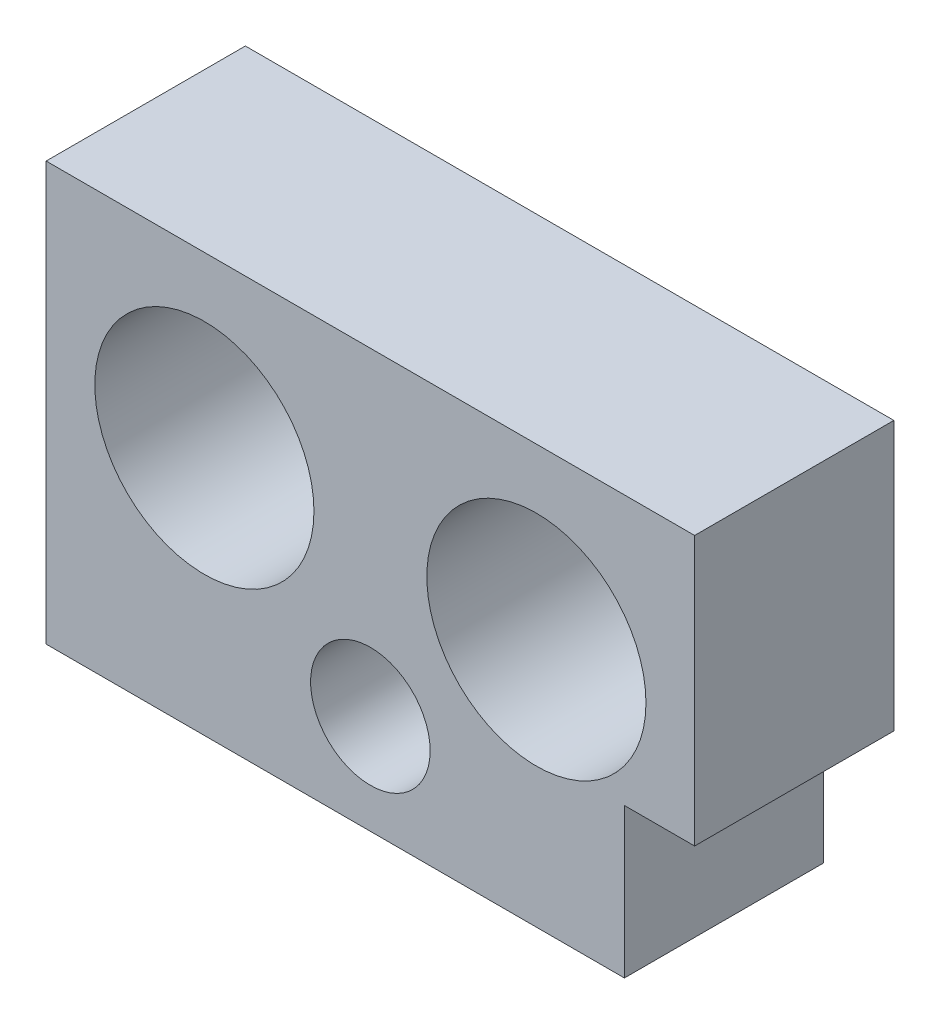
ISO-10303-21;
HEADER;
FILE_DESCRIPTION(('STEP AP214'),'2;1');
FILE_NAME('part.step','',(''),(''),'','','');
FILE_SCHEMA(('AUTOMOTIVE_DESIGN { 1 0 10303 214 1 1 1 1 }'));
ENDSEC;
DATA;
#1=APPLICATION_CONTEXT('core data for automotive mechanical design processes');
#2=APPLICATION_PROTOCOL_DEFINITION('international standard','automotive_design',2000,#1);
#3=PRODUCT_CONTEXT('',#1,'mechanical');
#4=PRODUCT('Part','Part','',(#3));
#5=PRODUCT_RELATED_PRODUCT_CATEGORY('part','',(#4));
#6=PRODUCT_DEFINITION_FORMATION('','',#4);
#7=PRODUCT_DEFINITION_CONTEXT('part definition',#1,'design');
#8=PRODUCT_DEFINITION('design','',#6,#7);
#9=PRODUCT_DEFINITION_SHAPE('','',#8);
#10=(LENGTH_UNIT() NAMED_UNIT(*) SI_UNIT(.MILLI.,.METRE.));
#11=(NAMED_UNIT(*) PLANE_ANGLE_UNIT() SI_UNIT($,.RADIAN.));
#12=(NAMED_UNIT(*) SI_UNIT($,.STERADIAN.) SOLID_ANGLE_UNIT());
#13=UNCERTAINTY_MEASURE_WITH_UNIT(LENGTH_MEASURE(1.E-05),#10,'distance_accuracy_value','');
#14=(GEOMETRIC_REPRESENTATION_CONTEXT(3) GLOBAL_UNCERTAINTY_ASSIGNED_CONTEXT((#13)) GLOBAL_UNIT_ASSIGNED_CONTEXT((#10,
#11,#12)) REPRESENTATION_CONTEXT('',''));
#15=CARTESIAN_POINT('',(0.,0.,0.));
#16=DIRECTION('',(0.,0.,1.));
#17=DIRECTION('',(1.,0.,0.));
#18=AXIS2_PLACEMENT_3D('',#15,#16,#17);
#19=CARTESIAN_POINT('',(32.55,17.,20.));
#20=DIRECTION('',(-1.,0.,0.));
#21=DIRECTION('',(0.,-1.,0.));
#22=AXIS2_PLACEMENT_3D('',#19,#20,#21);
#23=PLANE('',#22);
#24=DIRECTION('',(0.,1.,0.));
#25=VECTOR('',#24,1.);
#26=CARTESIAN_POINT('',(32.55,17.,20.));
#27=LINE('',#26,#25);
#28=CARTESIAN_POINT('',(32.55,-10.,20.));
#29=VERTEX_POINT('',#28);
#30=CARTESIAN_POINT('',(32.55,17.,20.));
#31=VERTEX_POINT('',#30);
#32=EDGE_CURVE('E81',#29,#31,#27,.T.);
#33=ORIENTED_EDGE('',*,*,#32,.F.);
#34=DIRECTION('',(0.,0.,1.));
#35=VECTOR('',#34,1.);
#36=CARTESIAN_POINT('',(32.55,-10.,0.));
#37=LINE('',#36,#35);
#38=CARTESIAN_POINT('',(32.55,-10.,0.));
#39=VERTEX_POINT('',#38);
#40=EDGE_CURVE('E101',#39,#29,#37,.T.);
#41=ORIENTED_EDGE('',*,*,#40,.F.);
#42=DIRECTION('',(0.,1.,0.));
#43=VECTOR('',#42,1.);
#44=CARTESIAN_POINT('',(32.55,17.,0.));
#45=LINE('',#44,#43);
#46=CARTESIAN_POINT('',(32.55,17.,0.));
#47=VERTEX_POINT('',#46);
#48=EDGE_CURVE('E107',#39,#47,#45,.T.);
#49=ORIENTED_EDGE('',*,*,#48,.T.);
#50=DIRECTION('',(0.,0.,-1.));
#51=VECTOR('',#50,1.);
#52=CARTESIAN_POINT('',(32.55,17.,20.));
#53=LINE('',#52,#51);
#54=EDGE_CURVE('E11',#31,#47,#53,.T.);
#55=ORIENTED_EDGE('',*,*,#54,.F.);
#56=EDGE_LOOP('',(#33,#41,#49,#55));
#57=FACE_BOUND('',#56,.T.);
#58=ADVANCED_FACE('F34',(#57),#23,.F.);
#59=CARTESIAN_POINT('',(-32.55,17.,20.));
#60=DIRECTION('',(0.,-1.,0.));
#61=DIRECTION('',(0.,0.,-1.));
#62=AXIS2_PLACEMENT_3D('',#59,#60,#61);
#63=PLANE('',#62);
#64=DIRECTION('',(-1.,0.,0.));
#65=VECTOR('',#64,1.);
#66=CARTESIAN_POINT('',(-32.55,17.,0.));
#67=LINE('',#66,#65);
#68=CARTESIAN_POINT('',(-32.55,17.,0.));
#69=VERTEX_POINT('',#68);
#70=EDGE_CURVE('E112',#47,#69,#67,.T.);
#71=ORIENTED_EDGE('',*,*,#70,.T.);
#72=DIRECTION('',(0.,0.,-1.));
#73=VECTOR('',#72,1.);
#74=CARTESIAN_POINT('',(-32.55,17.,20.));
#75=LINE('',#74,#73);
#76=CARTESIAN_POINT('',(-32.55,17.,20.));
#77=VERTEX_POINT('',#76);
#78=EDGE_CURVE('E41',#77,#69,#75,.T.);
#79=ORIENTED_EDGE('',*,*,#78,.F.);
#80=DIRECTION('',(-1.,0.,0.));
#81=VECTOR('',#80,1.);
#82=CARTESIAN_POINT('',(-32.55,17.,20.));
#83=LINE('',#82,#81);
#84=EDGE_CURVE('E136',#31,#77,#83,.T.);
#85=ORIENTED_EDGE('',*,*,#84,.F.);
#86=ORIENTED_EDGE('',*,*,#54,.T.);
#87=EDGE_LOOP('',(#71,#79,#85,#86));
#88=FACE_BOUND('',#87,.T.);
#89=ADVANCED_FACE('F135',(#88),#63,.F.);
#90=CARTESIAN_POINT('',(-32.55,-25.,20.));
#91=DIRECTION('',(1.,0.,0.));
#92=DIRECTION('',(0.,1.,0.));
#93=AXIS2_PLACEMENT_3D('',#90,#91,#92);
#94=PLANE('',#93);
#95=DIRECTION('',(0.,-1.,0.));
#96=VECTOR('',#95,1.);
#97=CARTESIAN_POINT('',(-32.55,-25.,0.));
#98=LINE('',#97,#96);
#99=CARTESIAN_POINT('',(-32.55,-25.,0.));
#100=VERTEX_POINT('',#99);
#101=EDGE_CURVE('E115',#69,#100,#98,.T.);
#102=ORIENTED_EDGE('',*,*,#101,.T.);
#103=DIRECTION('',(0.,0.,-1.));
#104=VECTOR('',#103,1.);
#105=CARTESIAN_POINT('',(-32.55,-25.,20.));
#106=LINE('',#105,#104);
#107=CARTESIAN_POINT('',(-32.55,-25.,20.));
#108=VERTEX_POINT('',#107);
#109=EDGE_CURVE('E126',#108,#100,#106,.T.);
#110=ORIENTED_EDGE('',*,*,#109,.F.);
#111=DIRECTION('',(0.,-1.,0.));
#112=VECTOR('',#111,1.);
#113=CARTESIAN_POINT('',(-32.55,-25.,20.));
#114=LINE('',#113,#112);
#115=EDGE_CURVE('E121',#77,#108,#114,.T.);
#116=ORIENTED_EDGE('',*,*,#115,.F.);
#117=ORIENTED_EDGE('',*,*,#78,.T.);
#118=EDGE_LOOP('',(#102,#110,#116,#117));
#119=FACE_BOUND('',#118,.T.);
#120=ADVANCED_FACE('F131',(#119),#94,.F.);
#121=CARTESIAN_POINT('',(-30.55,-25.,20.));
#122=DIRECTION('',(0.,1.,0.));
#123=DIRECTION('',(-1.,0.,0.));
#124=AXIS2_PLACEMENT_3D('',#121,#122,#123);
#125=PLANE('',#124);
#126=DIRECTION('',(1.,0.,0.));
#127=VECTOR('',#126,1.);
#128=CARTESIAN_POINT('',(-30.55,-25.,0.));
#129=LINE('',#128,#127);
#130=CARTESIAN_POINT('',(25.5,-25.,0.));
#131=VERTEX_POINT('',#130);
#132=EDGE_CURVE('E75',#100,#131,#129,.T.);
#133=ORIENTED_EDGE('',*,*,#132,.T.);
#134=DIRECTION('',(0.,0.,1.));
#135=VECTOR('',#134,1.);
#136=CARTESIAN_POINT('',(25.5,-25.,0.));
#137=LINE('',#136,#135);
#138=CARTESIAN_POINT('',(25.5,-25.,20.));
#139=VERTEX_POINT('',#138);
#140=EDGE_CURVE('E152',#131,#139,#137,.T.);
#141=ORIENTED_EDGE('',*,*,#140,.T.);
#142=DIRECTION('',(1.,0.,0.));
#143=VECTOR('',#142,1.);
#144=CARTESIAN_POINT('',(32.55,-25.,20.));
#145=LINE('',#144,#143);
#146=EDGE_CURVE('E57',#108,#139,#145,.T.);
#147=ORIENTED_EDGE('',*,*,#146,.F.);
#148=ORIENTED_EDGE('',*,*,#109,.T.);
#149=EDGE_LOOP('',(#133,#141,#147,#148));
#150=FACE_BOUND('',#149,.T.);
#151=ADVANCED_FACE('F160',(#150),#125,.F.);
#152=CARTESIAN_POINT('',(0.,0.,20.));
#153=DIRECTION('',(0.,0.,-1.));
#154=DIRECTION('',(-1.,0.,0.));
#155=AXIS2_PLACEMENT_3D('',#152,#153,#154);
#156=PLANE('',#155);
#157=CARTESIAN_POINT('',(16.665,0.,20.));
#158=DIRECTION('',(0.,0.,1.));
#159=DIRECTION('',(1.,0.,0.));
#160=AXIS2_PLACEMENT_3D('',#157,#158,#159);
#161=CIRCLE('',#160,11.);
#162=CARTESIAN_POINT('',(27.665,0.,20.));
#163=VERTEX_POINT('',#162);
#164=EDGE_CURVE('E143',#163,#163,#161,.T.);
#165=ORIENTED_EDGE('',*,*,#164,.F.);
#166=EDGE_LOOP('',(#165));
#167=FACE_BOUND('',#166,.T.);
#168=CARTESIAN_POINT('',(0.,-15.,20.));
#169=DIRECTION('',(0.,0.,1.));
#170=DIRECTION('',(1.,0.,0.));
#171=AXIS2_PLACEMENT_3D('',#168,#169,#170);
#172=CIRCLE('',#171,6.);
#173=CARTESIAN_POINT('',(6.,-15.,20.));
#174=VERTEX_POINT('',#173);
#175=EDGE_CURVE('E149',#174,#174,#172,.T.);
#176=ORIENTED_EDGE('',*,*,#175,.F.);
#177=EDGE_LOOP('',(#176));
#178=FACE_BOUND('',#177,.T.);
#179=CARTESIAN_POINT('',(-16.665,0.,20.));
#180=DIRECTION('',(0.,0.,1.));
#181=DIRECTION('',(1.,0.,0.));
#182=AXIS2_PLACEMENT_3D('',#179,#180,#181);
#183=CIRCLE('',#182,11.);
#184=CARTESIAN_POINT('',(-5.66500000000001,0.,20.));
#185=VERTEX_POINT('',#184);
#186=EDGE_CURVE('E118',#185,#185,#183,.T.);
#187=ORIENTED_EDGE('',*,*,#186,.F.);
#188=EDGE_LOOP('',(#187));
#189=FACE_BOUND('',#188,.T.);
#190=ORIENTED_EDGE('',*,*,#146,.T.);
#191=DIRECTION('',(0.,-1.,0.));
#192=VECTOR('',#191,1.);
#193=CARTESIAN_POINT('',(25.5,-25.,20.));
#194=LINE('',#193,#192);
#195=CARTESIAN_POINT('',(25.5,-10.,20.));
#196=VERTEX_POINT('',#195);
#197=EDGE_CURVE('E104',#196,#139,#194,.T.);
#198=ORIENTED_EDGE('',*,*,#197,.F.);
#199=DIRECTION('',(-1.,0.,0.));
#200=VECTOR('',#199,1.);
#201=CARTESIAN_POINT('',(32.55,-10.,20.));
#202=LINE('',#201,#200);
#203=EDGE_CURVE('E158',#29,#196,#202,.T.);
#204=ORIENTED_EDGE('',*,*,#203,.F.);
#205=ORIENTED_EDGE('',*,*,#32,.T.);
#206=ORIENTED_EDGE('',*,*,#84,.T.);
#207=ORIENTED_EDGE('',*,*,#115,.T.);
#208=EDGE_LOOP('',(#190,#198,#204,#205,#206,#207));
#209=FACE_BOUND('',#208,.T.);
#210=ADVANCED_FACE('F162',(#167,#178,#189,#209),#156,.F.);
#211=CARTESIAN_POINT('',(0.,0.,0.));
#212=DIRECTION('',(0.,0.,-1.));
#213=DIRECTION('',(-1.,0.,0.));
#214=AXIS2_PLACEMENT_3D('',#211,#212,#213);
#215=PLANE('',#214);
#216=DIRECTION('',(0.,-1.,0.));
#217=VECTOR('',#216,1.);
#218=CARTESIAN_POINT('',(25.5,-25.,0.));
#219=LINE('',#218,#217);
#220=CARTESIAN_POINT('',(25.5,-10.,0.));
#221=VERTEX_POINT('',#220);
#222=EDGE_CURVE('E48',#221,#131,#219,.T.);
#223=ORIENTED_EDGE('',*,*,#222,.T.);
#224=ORIENTED_EDGE('',*,*,#132,.F.);
#225=ORIENTED_EDGE('',*,*,#101,.F.);
#226=ORIENTED_EDGE('',*,*,#70,.F.);
#227=ORIENTED_EDGE('',*,*,#48,.F.);
#228=DIRECTION('',(-1.,0.,0.));
#229=VECTOR('',#228,1.);
#230=CARTESIAN_POINT('',(32.55,-10.,0.));
#231=LINE('',#230,#229);
#232=EDGE_CURVE('E97',#39,#221,#231,.T.);
#233=ORIENTED_EDGE('',*,*,#232,.T.);
#234=EDGE_LOOP('',(#223,#224,#225,#226,#227,#233));
#235=FACE_BOUND('',#234,.T.);
#236=CARTESIAN_POINT('',(16.665,0.,0.));
#237=DIRECTION('',(0.,0.,1.));
#238=DIRECTION('',(1.,0.,0.));
#239=AXIS2_PLACEMENT_3D('',#236,#237,#238);
#240=CIRCLE('',#239,11.);
#241=CARTESIAN_POINT('',(27.665,0.,0.));
#242=VERTEX_POINT('',#241);
#243=EDGE_CURVE('E141',#242,#242,#240,.T.);
#244=ORIENTED_EDGE('',*,*,#243,.T.);
#245=EDGE_LOOP('',(#244));
#246=FACE_BOUND('',#245,.T.);
#247=CARTESIAN_POINT('',(0.,-15.,0.));
#248=DIRECTION('',(0.,0.,1.));
#249=DIRECTION('',(1.,0.,0.));
#250=AXIS2_PLACEMENT_3D('',#247,#248,#249);
#251=CIRCLE('',#250,6.);
#252=CARTESIAN_POINT('',(6.,-15.,0.));
#253=VERTEX_POINT('',#252);
#254=EDGE_CURVE('E146',#253,#253,#251,.T.);
#255=ORIENTED_EDGE('',*,*,#254,.T.);
#256=EDGE_LOOP('',(#255));
#257=FACE_BOUND('',#256,.T.);
#258=CARTESIAN_POINT('',(-16.665,0.,0.));
#259=DIRECTION('',(0.,0.,1.));
#260=DIRECTION('',(1.,0.,0.));
#261=AXIS2_PLACEMENT_3D('',#258,#259,#260);
#262=CIRCLE('',#261,11.);
#263=CARTESIAN_POINT('',(-5.66500000000001,0.,0.));
#264=VERTEX_POINT('',#263);
#265=EDGE_CURVE('E113',#264,#264,#262,.T.);
#266=ORIENTED_EDGE('',*,*,#265,.T.);
#267=EDGE_LOOP('',(#266));
#268=FACE_BOUND('',#267,.T.);
#269=ADVANCED_FACE('F110',(#235,#246,#257,#268),#215,.T.);
#270=CARTESIAN_POINT('',(-16.665,0.,0.));
#271=DIRECTION('',(0.,0.,1.));
#272=DIRECTION('',(1.,0.,0.));
#273=AXIS2_PLACEMENT_3D('',#270,#271,#272);
#274=CYLINDRICAL_SURFACE('',#273,11.);
#275=ORIENTED_EDGE('',*,*,#265,.F.);
#276=EDGE_LOOP('',(#275));
#277=FACE_BOUND('',#276,.T.);
#278=ORIENTED_EDGE('',*,*,#186,.T.);
#279=EDGE_LOOP('',(#278));
#280=FACE_BOUND('',#279,.T.);
#281=ADVANCED_FACE('F188',(#277,#280),#274,.F.);
#282=CARTESIAN_POINT('',(0.,-15.,0.));
#283=DIRECTION('',(0.,0.,1.));
#284=DIRECTION('',(1.,0.,0.));
#285=AXIS2_PLACEMENT_3D('',#282,#283,#284);
#286=CYLINDRICAL_SURFACE('',#285,6.);
#287=ORIENTED_EDGE('',*,*,#254,.F.);
#288=EDGE_LOOP('',(#287));
#289=FACE_BOUND('',#288,.T.);
#290=ORIENTED_EDGE('',*,*,#175,.T.);
#291=EDGE_LOOP('',(#290));
#292=FACE_BOUND('',#291,.T.);
#293=ADVANCED_FACE('F172',(#289,#292),#286,.F.);
#294=CARTESIAN_POINT('',(16.665,0.,0.));
#295=DIRECTION('',(0.,0.,1.));
#296=DIRECTION('',(1.,0.,0.));
#297=AXIS2_PLACEMENT_3D('',#294,#295,#296);
#298=CYLINDRICAL_SURFACE('',#297,11.);
#299=ORIENTED_EDGE('',*,*,#243,.F.);
#300=EDGE_LOOP('',(#299));
#301=FACE_BOUND('',#300,.T.);
#302=ORIENTED_EDGE('',*,*,#164,.T.);
#303=EDGE_LOOP('',(#302));
#304=FACE_BOUND('',#303,.T.);
#305=ADVANCED_FACE('F165',(#301,#304),#298,.F.);
#306=CARTESIAN_POINT('',(25.5,-25.,0.));
#307=DIRECTION('',(-1.,0.,0.));
#308=DIRECTION('',(0.,0.,1.));
#309=AXIS2_PLACEMENT_3D('',#306,#307,#308);
#310=PLANE('',#309);
#311=ORIENTED_EDGE('',*,*,#197,.T.);
#312=ORIENTED_EDGE('',*,*,#140,.F.);
#313=ORIENTED_EDGE('',*,*,#222,.F.);
#314=DIRECTION('',(0.,0.,1.));
#315=VECTOR('',#314,1.);
#316=CARTESIAN_POINT('',(25.5,-10.,0.));
#317=LINE('',#316,#315);
#318=EDGE_CURVE('E102',#221,#196,#317,.T.);
#319=ORIENTED_EDGE('',*,*,#318,.T.);
#320=EDGE_LOOP('',(#311,#312,#313,#319));
#321=FACE_BOUND('',#320,.T.);
#322=ADVANCED_FACE('F163',(#321),#310,.F.);
#323=CARTESIAN_POINT('',(32.55,-10.,0.));
#324=DIRECTION('',(0.,1.,0.));
#325=DIRECTION('',(0.,0.,1.));
#326=AXIS2_PLACEMENT_3D('',#323,#324,#325);
#327=PLANE('',#326);
#328=ORIENTED_EDGE('',*,*,#203,.T.);
#329=ORIENTED_EDGE('',*,*,#318,.F.);
#330=ORIENTED_EDGE('',*,*,#232,.F.);
#331=ORIENTED_EDGE('',*,*,#40,.T.);
#332=EDGE_LOOP('',(#328,#329,#330,#331));
#333=FACE_BOUND('',#332,.T.);
#334=ADVANCED_FACE('F100',(#333),#327,.F.);
#335=CLOSED_SHELL('',(#58,#89,#120,#151,#210,#269,#281,#293,#305,#322,#334));
#336=MANIFOLD_SOLID_BREP('B2',#335);
#337=ADVANCED_BREP_SHAPE_REPRESENTATION('',(#18,#336),#14);
#338=SHAPE_DEFINITION_REPRESENTATION(#9,#337);
ENDSEC;
END-ISO-10303-21;
